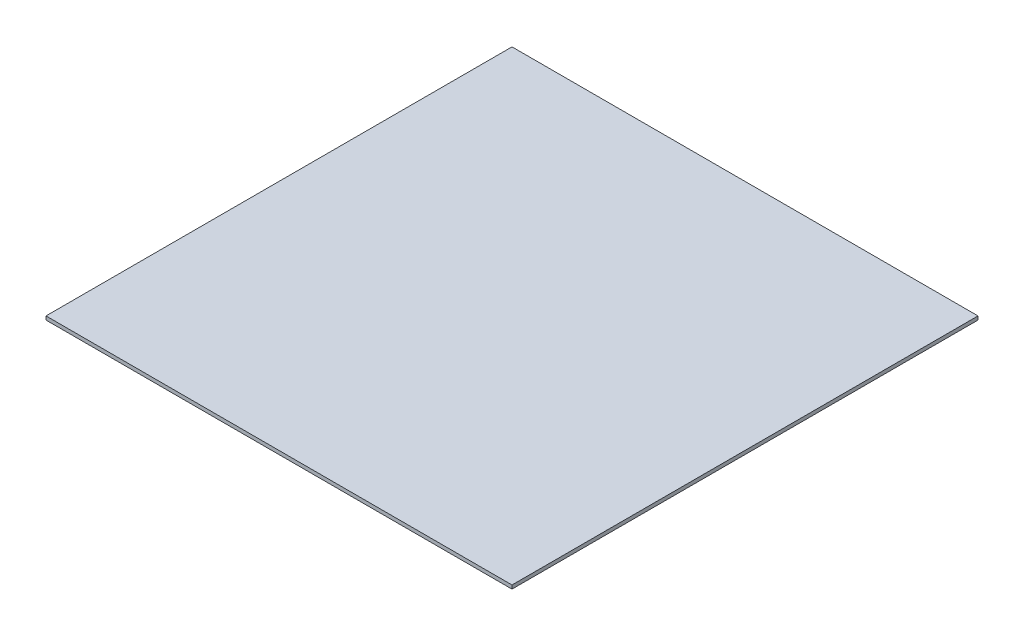
ISO-10303-21;
HEADER;
FILE_DESCRIPTION(('STEP AP214'),'2;1');
FILE_NAME('part.step','',(''),(''),'','','');
FILE_SCHEMA(('AUTOMOTIVE_DESIGN { 1 0 10303 214 1 1 1 1 }'));
ENDSEC;
DATA;
#1=APPLICATION_CONTEXT('core data for automotive mechanical design processes');
#2=APPLICATION_PROTOCOL_DEFINITION('international standard','automotive_design',2000,#1);
#3=PRODUCT_CONTEXT('',#1,'mechanical');
#4=PRODUCT('Part','Part','',(#3));
#5=PRODUCT_RELATED_PRODUCT_CATEGORY('part','',(#4));
#6=PRODUCT_DEFINITION_FORMATION('','',#4);
#7=PRODUCT_DEFINITION_CONTEXT('part definition',#1,'design');
#8=PRODUCT_DEFINITION('design','',#6,#7);
#9=PRODUCT_DEFINITION_SHAPE('','',#8);
#10=(LENGTH_UNIT() NAMED_UNIT(*) SI_UNIT(.MILLI.,.METRE.));
#11=(NAMED_UNIT(*) PLANE_ANGLE_UNIT() SI_UNIT($,.RADIAN.));
#12=(NAMED_UNIT(*) SI_UNIT($,.STERADIAN.) SOLID_ANGLE_UNIT());
#13=UNCERTAINTY_MEASURE_WITH_UNIT(LENGTH_MEASURE(1.E-05),#10,'distance_accuracy_value','');
#14=(GEOMETRIC_REPRESENTATION_CONTEXT(3) GLOBAL_UNCERTAINTY_ASSIGNED_CONTEXT((#13)) GLOBAL_UNIT_ASSIGNED_CONTEXT((#10,
#11,#12)) REPRESENTATION_CONTEXT('',''));
#15=CARTESIAN_POINT('',(0.,0.,0.));
#16=DIRECTION('',(0.,0.,1.));
#17=DIRECTION('',(1.,0.,0.));
#18=AXIS2_PLACEMENT_3D('',#15,#16,#17);
#19=CARTESIAN_POINT('',(-83.9080924855491,0.889,48.5609826589595));
#20=DIRECTION('',(1.,0.,0.));
#21=DIRECTION('',(0.,0.,-1.));
#22=AXIS2_PLACEMENT_3D('',#19,#20,#21);
#23=PLANE('',#22);
#24=DIRECTION('',(0.,0.,1.));
#25=VECTOR('',#24,1.);
#26=CARTESIAN_POINT('',(-83.9080924855491,0.,48.5609826589595));
#27=LINE('',#26,#25);
#28=CARTESIAN_POINT('',(-83.9080924855491,0.,-65.7390173410405));
#29=VERTEX_POINT('',#28);
#30=CARTESIAN_POINT('',(-83.9080924855491,0.,48.5609826589595));
#31=VERTEX_POINT('',#30);
#32=EDGE_CURVE('E107',#29,#31,#27,.T.);
#33=ORIENTED_EDGE('',*,*,#32,.T.);
#34=DIRECTION('',(0.,-1.,0.));
#35=VECTOR('',#34,1.);
#36=CARTESIAN_POINT('',(-83.9080924855491,0.889,48.5609826589595));
#37=LINE('',#36,#35);
#38=CARTESIAN_POINT('',(-83.9080924855491,0.889,48.5609826589595));
#39=VERTEX_POINT('',#38);
#40=EDGE_CURVE('E11',#39,#31,#37,.T.);
#41=ORIENTED_EDGE('',*,*,#40,.F.);
#42=DIRECTION('',(0.,0.,1.));
#43=VECTOR('',#42,1.);
#44=CARTESIAN_POINT('',(-83.9080924855491,0.889,48.5609826589595));
#45=LINE('',#44,#43);
#46=CARTESIAN_POINT('',(-83.9080924855491,0.889,-65.7390173410405));
#47=VERTEX_POINT('',#46);
#48=EDGE_CURVE('E91',#47,#39,#45,.T.);
#49=ORIENTED_EDGE('',*,*,#48,.F.);
#50=DIRECTION('',(0.,-1.,0.));
#51=VECTOR('',#50,1.);
#52=CARTESIAN_POINT('',(-83.9080924855491,0.889,-65.7390173410405));
#53=LINE('',#52,#51);
#54=EDGE_CURVE('E103',#47,#29,#53,.T.);
#55=ORIENTED_EDGE('',*,*,#54,.T.);
#56=EDGE_LOOP('',(#33,#41,#49,#55));
#57=FACE_BOUND('',#56,.T.);
#58=ADVANCED_FACE('F39',(#57),#23,.F.);
#59=CARTESIAN_POINT('',(-83.9080924855491,0.889,48.5609826589595));
#60=DIRECTION('',(0.,0.,-1.));
#61=DIRECTION('',(-1.,0.,0.));
#62=AXIS2_PLACEMENT_3D('',#59,#60,#61);
#63=PLANE('',#62);
#64=DIRECTION('',(1.,0.,0.));
#65=VECTOR('',#64,1.);
#66=CARTESIAN_POINT('',(-83.9080924855491,0.,48.5609826589595));
#67=LINE('',#66,#65);
#68=CARTESIAN_POINT('',(30.3919075144509,0.,48.5609826589595));
#69=VERTEX_POINT('',#68);
#70=EDGE_CURVE('E96',#31,#69,#67,.T.);
#71=ORIENTED_EDGE('',*,*,#70,.T.);
#72=DIRECTION('',(0.,-1.,0.));
#73=VECTOR('',#72,1.);
#74=CARTESIAN_POINT('',(30.3919075144509,0.889,48.5609826589595));
#75=LINE('',#74,#73);
#76=CARTESIAN_POINT('',(30.3919075144509,0.889,48.5609826589595));
#77=VERTEX_POINT('',#76);
#78=EDGE_CURVE('E48',#77,#69,#75,.T.);
#79=ORIENTED_EDGE('',*,*,#78,.F.);
#80=DIRECTION('',(1.,0.,0.));
#81=VECTOR('',#80,1.);
#82=CARTESIAN_POINT('',(-83.9080924855491,0.889,48.5609826589595));
#83=LINE('',#82,#81);
#84=EDGE_CURVE('E86',#39,#77,#83,.T.);
#85=ORIENTED_EDGE('',*,*,#84,.F.);
#86=ORIENTED_EDGE('',*,*,#40,.T.);
#87=EDGE_LOOP('',(#71,#79,#85,#86));
#88=FACE_BOUND('',#87,.T.);
#89=ADVANCED_FACE('F95',(#88),#63,.F.);
#90=CARTESIAN_POINT('',(30.3919075144509,0.889,48.5609826589595));
#91=DIRECTION('',(-1.,0.,0.));
#92=DIRECTION('',(0.,0.,1.));
#93=AXIS2_PLACEMENT_3D('',#90,#91,#92);
#94=PLANE('',#93);
#95=DIRECTION('',(0.,0.,-1.));
#96=VECTOR('',#95,1.);
#97=CARTESIAN_POINT('',(30.3919075144509,0.,48.5609826589595));
#98=LINE('',#97,#96);
#99=CARTESIAN_POINT('',(30.3919075144509,0.,-65.7390173410405));
#100=VERTEX_POINT('',#99);
#101=EDGE_CURVE('E73',#69,#100,#98,.T.);
#102=ORIENTED_EDGE('',*,*,#101,.T.);
#103=DIRECTION('',(0.,-1.,0.));
#104=VECTOR('',#103,1.);
#105=CARTESIAN_POINT('',(30.3919075144509,0.889,-65.7390173410405));
#106=LINE('',#105,#104);
#107=CARTESIAN_POINT('',(30.3919075144509,0.889,-65.7390173410405));
#108=VERTEX_POINT('',#107);
#109=EDGE_CURVE('E98',#108,#100,#106,.T.);
#110=ORIENTED_EDGE('',*,*,#109,.F.);
#111=DIRECTION('',(0.,0.,-1.));
#112=VECTOR('',#111,1.);
#113=CARTESIAN_POINT('',(30.3919075144509,0.889,48.5609826589595));
#114=LINE('',#113,#112);
#115=EDGE_CURVE('E89',#77,#108,#114,.T.);
#116=ORIENTED_EDGE('',*,*,#115,.F.);
#117=ORIENTED_EDGE('',*,*,#78,.T.);
#118=EDGE_LOOP('',(#102,#110,#116,#117));
#119=FACE_BOUND('',#118,.T.);
#120=ADVANCED_FACE('F99',(#119),#94,.F.);
#121=CARTESIAN_POINT('',(-83.9080924855491,0.889,-65.7390173410405));
#122=DIRECTION('',(0.,0.,1.));
#123=DIRECTION('',(1.,0.,0.));
#124=AXIS2_PLACEMENT_3D('',#121,#122,#123);
#125=PLANE('',#124);
#126=DIRECTION('',(-1.,0.,0.));
#127=VECTOR('',#126,1.);
#128=CARTESIAN_POINT('',(-83.9080924855491,0.,-65.7390173410405));
#129=LINE('',#128,#127);
#130=EDGE_CURVE('E79',#100,#29,#129,.T.);
#131=ORIENTED_EDGE('',*,*,#130,.T.);
#132=ORIENTED_EDGE('',*,*,#54,.F.);
#133=DIRECTION('',(-1.,0.,0.));
#134=VECTOR('',#133,1.);
#135=CARTESIAN_POINT('',(-83.9080924855491,0.889,-65.7390173410405));
#136=LINE('',#135,#134);
#137=EDGE_CURVE('E56',#108,#47,#136,.T.);
#138=ORIENTED_EDGE('',*,*,#137,.F.);
#139=ORIENTED_EDGE('',*,*,#109,.T.);
#140=EDGE_LOOP('',(#131,#132,#138,#139));
#141=FACE_BOUND('',#140,.T.);
#142=ADVANCED_FACE('F120',(#141),#125,.F.);
#143=CARTESIAN_POINT('',(0.,0.889,0.));
#144=DIRECTION('',(0.,-1.,0.));
#145=DIRECTION('',(0.,0.,-1.));
#146=AXIS2_PLACEMENT_3D('',#143,#144,#145);
#147=PLANE('',#146);
#148=ORIENTED_EDGE('',*,*,#48,.T.);
#149=ORIENTED_EDGE('',*,*,#84,.T.);
#150=ORIENTED_EDGE('',*,*,#115,.T.);
#151=ORIENTED_EDGE('',*,*,#137,.T.);
#152=EDGE_LOOP('',(#148,#149,#150,#151));
#153=FACE_BOUND('',#152,.T.);
#154=ADVANCED_FACE('F87',(#153),#147,.F.);
#155=CARTESIAN_POINT('',(0.,0.,0.));
#156=DIRECTION('',(0.,-1.,0.));
#157=DIRECTION('',(0.,0.,-1.));
#158=AXIS2_PLACEMENT_3D('',#155,#156,#157);
#159=PLANE('',#158);
#160=ORIENTED_EDGE('',*,*,#32,.F.);
#161=ORIENTED_EDGE('',*,*,#130,.F.);
#162=ORIENTED_EDGE('',*,*,#101,.F.);
#163=ORIENTED_EDGE('',*,*,#70,.F.);
#164=EDGE_LOOP('',(#160,#161,#162,#163));
#165=FACE_BOUND('',#164,.T.);
#166=ADVANCED_FACE('F123',(#165),#159,.T.);
#167=CLOSED_SHELL('',(#58,#89,#120,#142,#154,#166));
#168=MANIFOLD_SOLID_BREP('B2',#167);
#169=ADVANCED_BREP_SHAPE_REPRESENTATION('',(#18,#168),#14);
#170=SHAPE_DEFINITION_REPRESENTATION(#9,#169);
ENDSEC;
END-ISO-10303-21;
